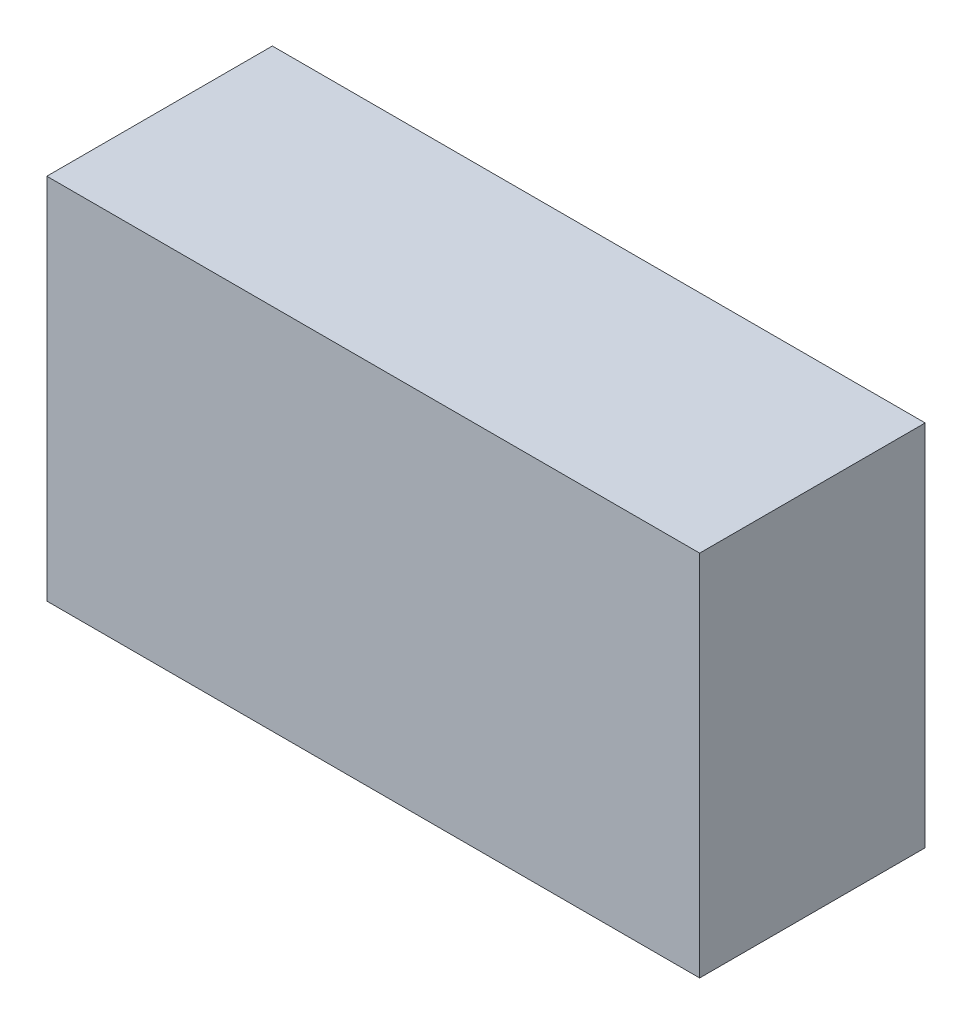
ISO-10303-21;
HEADER;
FILE_DESCRIPTION(('STEP AP214'),'2;1');
FILE_NAME('part.step','',(''),(''),'','','');
FILE_SCHEMA(('AUTOMOTIVE_DESIGN { 1 0 10303 214 1 1 1 1 }'));
ENDSEC;
DATA;
#1=APPLICATION_CONTEXT('core data for automotive mechanical design processes');
#2=APPLICATION_PROTOCOL_DEFINITION('international standard','automotive_design',2000,#1);
#3=PRODUCT_CONTEXT('',#1,'mechanical');
#4=PRODUCT('Part','Part','',(#3));
#5=PRODUCT_RELATED_PRODUCT_CATEGORY('part','',(#4));
#6=PRODUCT_DEFINITION_FORMATION('','',#4);
#7=PRODUCT_DEFINITION_CONTEXT('part definition',#1,'design');
#8=PRODUCT_DEFINITION('design','',#6,#7);
#9=PRODUCT_DEFINITION_SHAPE('','',#8);
#10=(LENGTH_UNIT() NAMED_UNIT(*) SI_UNIT(.MILLI.,.METRE.));
#11=(NAMED_UNIT(*) PLANE_ANGLE_UNIT() SI_UNIT($,.RADIAN.));
#12=(NAMED_UNIT(*) SI_UNIT($,.STERADIAN.) SOLID_ANGLE_UNIT());
#13=UNCERTAINTY_MEASURE_WITH_UNIT(LENGTH_MEASURE(1.E-05),#10,'distance_accuracy_value','');
#14=(GEOMETRIC_REPRESENTATION_CONTEXT(3) GLOBAL_UNCERTAINTY_ASSIGNED_CONTEXT((#13)) GLOBAL_UNIT_ASSIGNED_CONTEXT((#10,
#11,#12)) REPRESENTATION_CONTEXT('',''));
#15=CARTESIAN_POINT('',(0.,0.,0.));
#16=DIRECTION('',(0.,0.,1.));
#17=DIRECTION('',(1.,0.,0.));
#18=AXIS2_PLACEMENT_3D('',#15,#16,#17);
#19=CARTESIAN_POINT('',(-42.0681968010703,49.8564033327252,19.));
#20=DIRECTION('',(1.,0.,0.));
#21=DIRECTION('',(0.,1.,0.));
#22=AXIS2_PLACEMENT_3D('',#19,#20,#21);
#23=PLANE('',#22);
#24=DIRECTION('',(0.,-1.,0.));
#25=VECTOR('',#24,1.);
#26=CARTESIAN_POINT('',(-42.0681968010703,49.8564033327252,0.));
#27=LINE('',#26,#25);
#28=CARTESIAN_POINT('',(-42.0681968010703,49.8564033327252,0.));
#29=VERTEX_POINT('',#28);
#30=CARTESIAN_POINT('',(-42.0681968010703,18.8564033327252,0.));
#31=VERTEX_POINT('',#30);
#32=EDGE_CURVE('E98',#29,#31,#27,.T.);
#33=ORIENTED_EDGE('',*,*,#32,.T.);
#34=DIRECTION('',(0.,0.,-1.));
#35=VECTOR('',#34,1.);
#36=CARTESIAN_POINT('',(-42.0681968010703,18.8564033327252,19.));
#37=LINE('',#36,#35);
#38=CARTESIAN_POINT('',(-42.0681968010703,18.8564033327252,19.));
#39=VERTEX_POINT('',#38);
#40=EDGE_CURVE('E11',#39,#31,#37,.T.);
#41=ORIENTED_EDGE('',*,*,#40,.F.);
#42=DIRECTION('',(0.,-1.,0.));
#43=VECTOR('',#42,1.);
#44=CARTESIAN_POINT('',(-42.0681968010703,49.8564033327252,19.));
#45=LINE('',#44,#43);
#46=CARTESIAN_POINT('',(-42.0681968010703,49.8564033327252,19.));
#47=VERTEX_POINT('',#46);
#48=EDGE_CURVE('E86',#47,#39,#45,.T.);
#49=ORIENTED_EDGE('',*,*,#48,.F.);
#50=DIRECTION('',(0.,0.,-1.));
#51=VECTOR('',#50,1.);
#52=CARTESIAN_POINT('',(-42.0681968010703,49.8564033327252,19.));
#53=LINE('',#52,#51);
#54=EDGE_CURVE('E94',#47,#29,#53,.T.);
#55=ORIENTED_EDGE('',*,*,#54,.T.);
#56=EDGE_LOOP('',(#33,#41,#49,#55));
#57=FACE_BOUND('',#56,.T.);
#58=ADVANCED_FACE('F35',(#57),#23,.F.);
#59=CARTESIAN_POINT('',(-42.0681968010703,18.8564033327252,19.));
#60=DIRECTION('',(0.,1.,0.));
#61=DIRECTION('',(0.,0.,1.));
#62=AXIS2_PLACEMENT_3D('',#59,#60,#61);
#63=PLANE('',#62);
#64=DIRECTION('',(1.,0.,0.));
#65=VECTOR('',#64,1.);
#66=CARTESIAN_POINT('',(-42.0681968010703,18.8564033327252,0.));
#67=LINE('',#66,#65);
#68=CARTESIAN_POINT('',(12.9318031989297,18.8564033327252,0.));
#69=VERTEX_POINT('',#68);
#70=EDGE_CURVE('E90',#31,#69,#67,.T.);
#71=ORIENTED_EDGE('',*,*,#70,.T.);
#72=DIRECTION('',(0.,0.,-1.));
#73=VECTOR('',#72,1.);
#74=CARTESIAN_POINT('',(12.9318031989297,18.8564033327252,19.));
#75=LINE('',#74,#73);
#76=CARTESIAN_POINT('',(12.9318031989297,18.8564033327252,19.));
#77=VERTEX_POINT('',#76);
#78=EDGE_CURVE('E43',#77,#69,#75,.T.);
#79=ORIENTED_EDGE('',*,*,#78,.F.);
#80=DIRECTION('',(1.,0.,0.));
#81=VECTOR('',#80,1.);
#82=CARTESIAN_POINT('',(-42.0681968010703,18.8564033327252,19.));
#83=LINE('',#82,#81);
#84=EDGE_CURVE('E81',#39,#77,#83,.T.);
#85=ORIENTED_EDGE('',*,*,#84,.F.);
#86=ORIENTED_EDGE('',*,*,#40,.T.);
#87=EDGE_LOOP('',(#71,#79,#85,#86));
#88=FACE_BOUND('',#87,.T.);
#89=ADVANCED_FACE('F89',(#88),#63,.F.);
#90=CARTESIAN_POINT('',(12.9318031989296,49.8564033327252,19.));
#91=DIRECTION('',(-1.,0.,0.));
#92=DIRECTION('',(0.,-1.,0.));
#93=AXIS2_PLACEMENT_3D('',#90,#91,#92);
#94=PLANE('',#93);
#95=DIRECTION('',(0.,1.,0.));
#96=VECTOR('',#95,1.);
#97=CARTESIAN_POINT('',(12.9318031989296,49.8564033327252,0.));
#98=LINE('',#97,#96);
#99=CARTESIAN_POINT('',(12.9318031989296,49.8564033327252,0.));
#100=VERTEX_POINT('',#99);
#101=EDGE_CURVE('E68',#69,#100,#98,.T.);
#102=ORIENTED_EDGE('',*,*,#101,.T.);
#103=DIRECTION('',(0.,0.,-1.));
#104=VECTOR('',#103,1.);
#105=CARTESIAN_POINT('',(12.9318031989296,49.8564033327252,19.));
#106=LINE('',#105,#104);
#107=CARTESIAN_POINT('',(12.9318031989296,49.8564033327252,19.));
#108=VERTEX_POINT('',#107);
#109=EDGE_CURVE('E91',#108,#100,#106,.T.);
#110=ORIENTED_EDGE('',*,*,#109,.F.);
#111=DIRECTION('',(0.,1.,0.));
#112=VECTOR('',#111,1.);
#113=CARTESIAN_POINT('',(12.9318031989296,49.8564033327252,19.));
#114=LINE('',#113,#112);
#115=EDGE_CURVE('E84',#77,#108,#114,.T.);
#116=ORIENTED_EDGE('',*,*,#115,.F.);
#117=ORIENTED_EDGE('',*,*,#78,.T.);
#118=EDGE_LOOP('',(#102,#110,#116,#117));
#119=FACE_BOUND('',#118,.T.);
#120=ADVANCED_FACE('F92',(#119),#94,.F.);
#121=CARTESIAN_POINT('',(-42.0681968010703,49.8564033327252,19.));
#122=DIRECTION('',(0.,-1.,0.));
#123=DIRECTION('',(0.,0.,-1.));
#124=AXIS2_PLACEMENT_3D('',#121,#122,#123);
#125=PLANE('',#124);
#126=DIRECTION('',(-1.,0.,0.));
#127=VECTOR('',#126,1.);
#128=CARTESIAN_POINT('',(-42.0681968010703,49.8564033327252,0.));
#129=LINE('',#128,#127);
#130=EDGE_CURVE('E74',#100,#29,#129,.T.);
#131=ORIENTED_EDGE('',*,*,#130,.T.);
#132=ORIENTED_EDGE('',*,*,#54,.F.);
#133=DIRECTION('',(-1.,0.,0.));
#134=VECTOR('',#133,1.);
#135=CARTESIAN_POINT('',(-42.0681968010703,49.8564033327252,19.));
#136=LINE('',#135,#134);
#137=EDGE_CURVE('E51',#108,#47,#136,.T.);
#138=ORIENTED_EDGE('',*,*,#137,.F.);
#139=ORIENTED_EDGE('',*,*,#109,.T.);
#140=EDGE_LOOP('',(#131,#132,#138,#139));
#141=FACE_BOUND('',#140,.T.);
#142=ADVANCED_FACE('F105',(#141),#125,.F.);
#143=CARTESIAN_POINT('',(0.,0.,19.));
#144=DIRECTION('',(0.,0.,1.));
#145=DIRECTION('',(1.,0.,0.));
#146=AXIS2_PLACEMENT_3D('',#143,#144,#145);
#147=PLANE('',#146);
#148=ORIENTED_EDGE('',*,*,#48,.T.);
#149=ORIENTED_EDGE('',*,*,#84,.T.);
#150=ORIENTED_EDGE('',*,*,#115,.T.);
#151=ORIENTED_EDGE('',*,*,#137,.T.);
#152=EDGE_LOOP('',(#148,#149,#150,#151));
#153=FACE_BOUND('',#152,.T.);
#154=ADVANCED_FACE('F82',(#153),#147,.T.);
#155=CARTESIAN_POINT('',(0.,0.,0.));
#156=DIRECTION('',(0.,0.,1.));
#157=DIRECTION('',(1.,0.,0.));
#158=AXIS2_PLACEMENT_3D('',#155,#156,#157);
#159=PLANE('',#158);
#160=ORIENTED_EDGE('',*,*,#32,.F.);
#161=ORIENTED_EDGE('',*,*,#130,.F.);
#162=ORIENTED_EDGE('',*,*,#101,.F.);
#163=ORIENTED_EDGE('',*,*,#70,.F.);
#164=EDGE_LOOP('',(#160,#161,#162,#163));
#165=FACE_BOUND('',#164,.T.);
#166=ADVANCED_FACE('F108',(#165),#159,.F.);
#167=CLOSED_SHELL('',(#58,#89,#120,#142,#154,#166));
#168=MANIFOLD_SOLID_BREP('B2',#167);
#169=ADVANCED_BREP_SHAPE_REPRESENTATION('',(#18,#168),#14);
#170=SHAPE_DEFINITION_REPRESENTATION(#9,#169);
ENDSEC;
END-ISO-10303-21;
